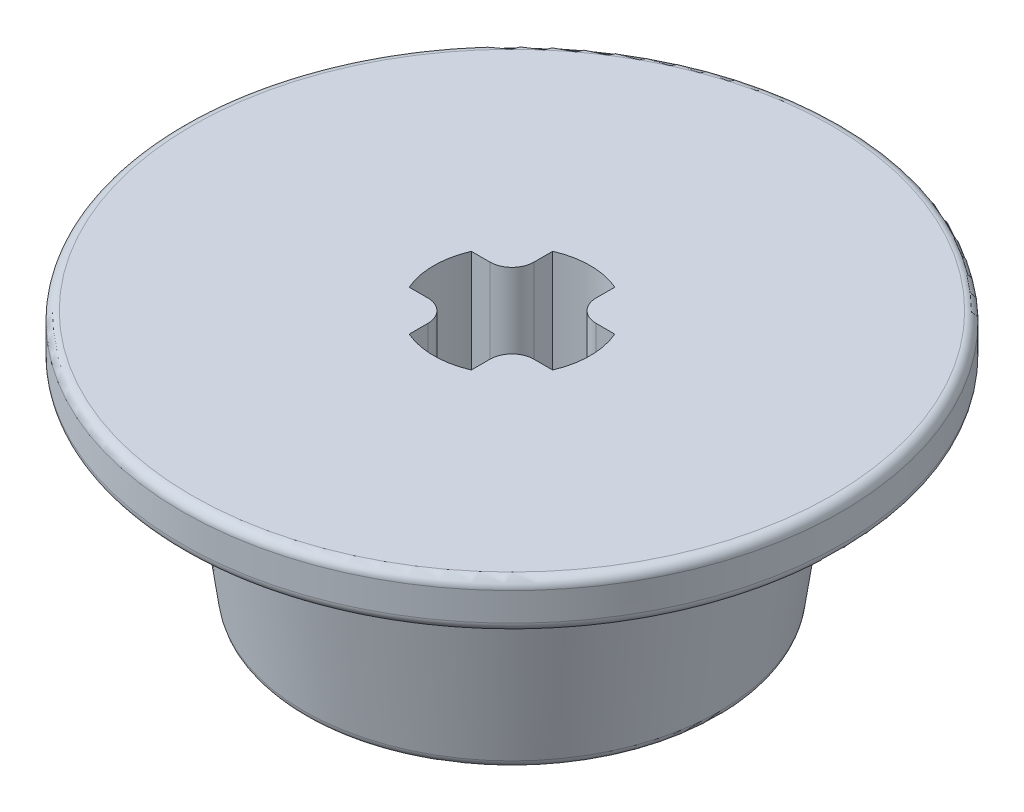
ISO-10303-21;
HEADER;
FILE_DESCRIPTION(('STEP AP214'),'2;1');
FILE_NAME('part.step','',(''),(''),'','','');
FILE_SCHEMA(('AUTOMOTIVE_DESIGN { 1 0 10303 214 1 1 1 1 }'));
ENDSEC;
DATA;
#1=APPLICATION_CONTEXT('core data for automotive mechanical design processes');
#2=APPLICATION_PROTOCOL_DEFINITION('international standard','automotive_design',2000,#1);
#3=PRODUCT_CONTEXT('',#1,'mechanical');
#4=PRODUCT('Part','Part','',(#3));
#5=PRODUCT_RELATED_PRODUCT_CATEGORY('part','',(#4));
#6=PRODUCT_DEFINITION_FORMATION('','',#4);
#7=PRODUCT_DEFINITION_CONTEXT('part definition',#1,'design');
#8=PRODUCT_DEFINITION('design','',#6,#7);
#9=PRODUCT_DEFINITION_SHAPE('','',#8);
#10=(LENGTH_UNIT() NAMED_UNIT(*) SI_UNIT(.MILLI.,.METRE.));
#11=(NAMED_UNIT(*) PLANE_ANGLE_UNIT() SI_UNIT($,.RADIAN.));
#12=(NAMED_UNIT(*) SI_UNIT($,.STERADIAN.) SOLID_ANGLE_UNIT());
#13=UNCERTAINTY_MEASURE_WITH_UNIT(LENGTH_MEASURE(1.E-05),#10,'distance_accuracy_value','');
#14=(GEOMETRIC_REPRESENTATION_CONTEXT(3) GLOBAL_UNCERTAINTY_ASSIGNED_CONTEXT((#13)) GLOBAL_UNIT_ASSIGNED_CONTEXT((#10,
#11,#12)) REPRESENTATION_CONTEXT('',''));
#15=CARTESIAN_POINT('',(0.,0.,0.));
#16=DIRECTION('',(0.,0.,1.));
#17=DIRECTION('',(1.,0.,0.));
#18=AXIS2_PLACEMENT_3D('',#15,#16,#17);
#19=CARTESIAN_POINT('',(0.,-1.83679026849459E-11,0.));
#20=DIRECTION('',(0.,1.,0.));
#21=DIRECTION('',(0.,0.,1.));
#22=AXIS2_PLACEMENT_3D('',#19,#20,#21);
#23=PLANE('',#22);
#24=CARTESIAN_POINT('',(0.,-1.83679026849459E-11,0.));
#25=DIRECTION('',(0.,1.,0.));
#26=DIRECTION('',(0.,0.,1.));
#27=AXIS2_PLACEMENT_3D('',#24,#25,#26);
#28=CIRCLE('',#27,10.2);
#29=CARTESIAN_POINT('',(0.,-1.83679026849459E-11,10.2));
#30=VERTEX_POINT('',#29);
#31=EDGE_CURVE('E292',#30,#30,#28,.T.);
#32=ORIENTED_EDGE('',*,*,#31,.T.);
#33=EDGE_LOOP('',(#32));
#34=FACE_BOUND('',#33,.T.);
#35=DIRECTION('',(0.,0.,1.));
#36=VECTOR('',#35,1.);
#37=CARTESIAN_POINT('',(-0.99,0.,0.990000000000009));
#38=LINE('',#37,#36);
#39=CARTESIAN_POINT('',(-0.99,0.,1.69000000000001));
#40=VERTEX_POINT('',#39);
#41=CARTESIAN_POINT('',(-0.99,0.,2.28473193175917));
#42=VERTEX_POINT('',#41);
#43=EDGE_CURVE('E209',#40,#42,#38,.T.);
#44=ORIENTED_EDGE('',*,*,#43,.F.);
#45=CARTESIAN_POINT('',(-1.69,-1.83672521636424E-11,1.69000000000001));
#46=DIRECTION('',(0.,1.,0.));
#47=DIRECTION('',(0.,0.,1.));
#48=AXIS2_PLACEMENT_3D('',#45,#46,#47);
#49=CIRCLE('',#48,0.7);
#50=CARTESIAN_POINT('',(-1.69,0.,0.990000000000009));
#51=VERTEX_POINT('',#50);
#52=EDGE_CURVE('E253',#40,#51,#49,.T.);
#53=ORIENTED_EDGE('',*,*,#52,.T.);
#54=DIRECTION('',(1.,0.,0.));
#55=VECTOR('',#54,1.);
#56=CARTESIAN_POINT('',(-2.28473193175917,0.,0.990000000000009));
#57=LINE('',#56,#55);
#58=CARTESIAN_POINT('',(-2.28473193175917,0.,0.99000000000001));
#59=VERTEX_POINT('',#58);
#60=EDGE_CURVE('E207',#59,#51,#57,.T.);
#61=ORIENTED_EDGE('',*,*,#60,.F.);
#62=CARTESIAN_POINT('',(0.,0.,0.));
#63=DIRECTION('',(0.,1.,0.));
#64=DIRECTION('',(0.,0.,1.));
#65=AXIS2_PLACEMENT_3D('',#62,#63,#64);
#66=CIRCLE('',#65,2.49);
#67=CARTESIAN_POINT('',(-2.28473193175917,0.,-0.99000000000001));
#68=VERTEX_POINT('',#67);
#69=EDGE_CURVE('E159',#68,#59,#66,.T.);
#70=ORIENTED_EDGE('',*,*,#69,.F.);
#71=DIRECTION('',(-1.,0.,0.));
#72=VECTOR('',#71,1.);
#73=CARTESIAN_POINT('',(-0.99,0.,-0.99000000000001));
#74=LINE('',#73,#72);
#75=CARTESIAN_POINT('',(-1.69,0.,-0.99000000000001));
#76=VERTEX_POINT('',#75);
#77=EDGE_CURVE('E204',#76,#68,#74,.T.);
#78=ORIENTED_EDGE('',*,*,#77,.F.);
#79=CARTESIAN_POINT('',(-1.69,-1.83672521636424E-11,-1.69000000000001));
#80=DIRECTION('',(0.,1.,0.));
#81=DIRECTION('',(0.,0.,1.));
#82=AXIS2_PLACEMENT_3D('',#79,#80,#81);
#83=CIRCLE('',#82,0.7);
#84=CARTESIAN_POINT('',(-0.99,0.,-1.69000000000001));
#85=VERTEX_POINT('',#84);
#86=EDGE_CURVE('E247',#76,#85,#83,.T.);
#87=ORIENTED_EDGE('',*,*,#86,.T.);
#88=DIRECTION('',(0.,0.,1.));
#89=VECTOR('',#88,1.);
#90=CARTESIAN_POINT('',(-0.99,0.,-2.28753254026193));
#91=LINE('',#90,#89);
#92=CARTESIAN_POINT('',(-0.99,0.,-2.28753254026193));
#93=VERTEX_POINT('',#92);
#94=EDGE_CURVE('E201',#93,#85,#91,.T.);
#95=ORIENTED_EDGE('',*,*,#94,.F.);
#96=CARTESIAN_POINT('',(0.,0.,0.));
#97=DIRECTION('',(0.,1.,0.));
#98=DIRECTION('',(0.,0.,-1.));
#99=AXIS2_PLACEMENT_3D('',#96,#97,#98);
#100=CIRCLE('',#99,2.49256998352247);
#101=CARTESIAN_POINT('',(0.99,0.,-2.28753254026193));
#102=VERTEX_POINT('',#101);
#103=EDGE_CURVE('E226',#102,#93,#100,.T.);
#104=ORIENTED_EDGE('',*,*,#103,.F.);
#105=DIRECTION('',(0.,0.,-1.));
#106=VECTOR('',#105,1.);
#107=CARTESIAN_POINT('',(0.99,0.,-2.28753254026193));
#108=LINE('',#107,#106);
#109=CARTESIAN_POINT('',(0.99,0.,-1.69));
#110=VERTEX_POINT('',#109);
#111=EDGE_CURVE('E224',#110,#102,#108,.T.);
#112=ORIENTED_EDGE('',*,*,#111,.F.);
#113=CARTESIAN_POINT('',(1.69,-1.83672521636424E-11,-1.69));
#114=DIRECTION('',(0.,1.,0.));
#115=DIRECTION('',(0.,0.,1.));
#116=AXIS2_PLACEMENT_3D('',#113,#114,#115);
#117=CIRCLE('',#116,0.7);
#118=CARTESIAN_POINT('',(1.69,0.,-0.990000000000003));
#119=VERTEX_POINT('',#118);
#120=EDGE_CURVE('E249',#110,#119,#117,.T.);
#121=ORIENTED_EDGE('',*,*,#120,.T.);
#122=DIRECTION('',(-1.,0.,0.));
#123=VECTOR('',#122,1.);
#124=CARTESIAN_POINT('',(0.99,0.,-0.990000000000003));
#125=LINE('',#124,#123);
#126=CARTESIAN_POINT('',(2.28424982597489,0.,-0.990000000000003));
#127=VERTEX_POINT('',#126);
#128=EDGE_CURVE('E222',#127,#119,#125,.T.);
#129=ORIENTED_EDGE('',*,*,#128,.F.);
#130=CARTESIAN_POINT('',(0.,0.,0.));
#131=DIRECTION('',(0.,1.,0.));
#132=DIRECTION('',(0.,0.,-1.));
#133=AXIS2_PLACEMENT_3D('',#130,#131,#132);
#134=CIRCLE('',#133,2.48955764493742);
#135=CARTESIAN_POINT('',(2.28424982597489,0.,0.990000000000003));
#136=VERTEX_POINT('',#135);
#137=EDGE_CURVE('E219',#136,#127,#134,.T.);
#138=ORIENTED_EDGE('',*,*,#137,.F.);
#139=DIRECTION('',(1.,0.,0.));
#140=VECTOR('',#139,1.);
#141=CARTESIAN_POINT('',(0.99,0.,0.990000000000003));
#142=LINE('',#141,#140);
#143=CARTESIAN_POINT('',(1.69,0.,0.990000000000003));
#144=VERTEX_POINT('',#143);
#145=EDGE_CURVE('E217',#144,#136,#142,.T.);
#146=ORIENTED_EDGE('',*,*,#145,.F.);
#147=CARTESIAN_POINT('',(1.69,-1.83672521636424E-11,1.69));
#148=DIRECTION('',(0.,1.,0.));
#149=DIRECTION('',(0.,0.,1.));
#150=AXIS2_PLACEMENT_3D('',#147,#148,#149);
#151=CIRCLE('',#150,0.7);
#152=CARTESIAN_POINT('',(0.99,0.,1.69));
#153=VERTEX_POINT('',#152);
#154=EDGE_CURVE('E251',#144,#153,#151,.T.);
#155=ORIENTED_EDGE('',*,*,#154,.T.);
#156=DIRECTION('',(0.,0.,-1.));
#157=VECTOR('',#156,1.);
#158=CARTESIAN_POINT('',(0.99,0.,2.28473193175917));
#159=LINE('',#158,#157);
#160=CARTESIAN_POINT('',(0.99,0.,2.28473193175917));
#161=VERTEX_POINT('',#160);
#162=EDGE_CURVE('E214',#161,#153,#159,.T.);
#163=ORIENTED_EDGE('',*,*,#162,.F.);
#164=CARTESIAN_POINT('',(0.,0.,0.));
#165=DIRECTION('',(0.,1.,0.));
#166=DIRECTION('',(0.,0.,1.));
#167=AXIS2_PLACEMENT_3D('',#164,#165,#166);
#168=CIRCLE('',#167,2.49);
#169=EDGE_CURVE('E211',#42,#161,#168,.T.);
#170=ORIENTED_EDGE('',*,*,#169,.F.);
#171=EDGE_LOOP('',(#44,#53,#61,#70,#78,#87,#95,#104,#112,#121,#129,#138,#146,#155,#163,#170));
#172=FACE_BOUND('',#171,.T.);
#173=ADVANCED_FACE('F36',(#34,#172),#23,.T.);
#174=CARTESIAN_POINT('',(0.,0.,0.));
#175=DIRECTION('',(0.,-1.,0.));
#176=DIRECTION('',(0.,0.,-1.));
#177=AXIS2_PLACEMENT_3D('',#174,#175,#176);
#178=CYLINDRICAL_SURFACE('',#177,10.5);
#179=CARTESIAN_POINT('',(0.,-0.300000000018368,0.));
#180=DIRECTION('',(0.,1.,0.));
#181=DIRECTION('',(0.,0.,1.));
#182=AXIS2_PLACEMENT_3D('',#179,#180,#181);
#183=CIRCLE('',#182,10.5);
#184=CARTESIAN_POINT('',(0.,-0.300000000018368,10.5));
#185=VERTEX_POINT('',#184);
#186=EDGE_CURVE('E289',#185,#185,#183,.F.);
#187=ORIENTED_EDGE('',*,*,#186,.T.);
#188=EDGE_LOOP('',(#187));
#189=FACE_BOUND('',#188,.T.);
#190=CARTESIAN_POINT('',(0.,-1.2,0.));
#191=DIRECTION('',(0.,-1.,0.));
#192=DIRECTION('',(0.,0.,-1.));
#193=AXIS2_PLACEMENT_3D('',#190,#191,#192);
#194=CIRCLE('',#193,10.5);
#195=CARTESIAN_POINT('',(0.,-1.2,-10.5));
#196=VERTEX_POINT('',#195);
#197=EDGE_CURVE('E286',#196,#196,#194,.F.);
#198=ORIENTED_EDGE('',*,*,#197,.T.);
#199=EDGE_LOOP('',(#198));
#200=FACE_BOUND('',#199,.T.);
#201=ADVANCED_FACE('F309',(#189,#200),#178,.T.);
#202=CARTESIAN_POINT('',(10.5,-1.5,0.));
#203=DIRECTION('',(0.,-1.,0.));
#204=DIRECTION('',(0.,0.,-1.));
#205=AXIS2_PLACEMENT_3D('',#202,#203,#204);
#206=PLANE('',#205);
#207=CARTESIAN_POINT('',(0.,-1.5,0.));
#208=DIRECTION('',(0.,-1.,0.));
#209=DIRECTION('',(0.,0.,-1.));
#210=AXIS2_PLACEMENT_3D('',#207,#208,#209);
#211=CIRCLE('',#210,7.76078602134487);
#212=CARTESIAN_POINT('',(0.,-1.5,-7.76078602134487));
#213=VERTEX_POINT('',#212);
#214=EDGE_CURVE('E11',#213,#213,#211,.F.);
#215=ORIENTED_EDGE('',*,*,#214,.T.);
#216=EDGE_LOOP('',(#215));
#217=FACE_BOUND('',#216,.T.);
#218=CARTESIAN_POINT('',(0.,-1.5,0.));
#219=DIRECTION('',(0.,-1.,0.));
#220=DIRECTION('',(0.,0.,-1.));
#221=AXIS2_PLACEMENT_3D('',#218,#219,#220);
#222=CIRCLE('',#221,10.2);
#223=CARTESIAN_POINT('',(0.,-1.5,-10.2));
#224=VERTEX_POINT('',#223);
#225=EDGE_CURVE('E44',#224,#224,#222,.T.);
#226=ORIENTED_EDGE('',*,*,#225,.T.);
#227=EDGE_LOOP('',(#226));
#228=FACE_BOUND('',#227,.T.);
#229=ADVANCED_FACE('F297',(#217,#228),#206,.T.);
#230=CARTESIAN_POINT('',(0.,-8.,0.));
#231=DIRECTION('',(0.,1.,0.));
#232=DIRECTION('',(0.,0.,1.));
#233=AXIS2_PLACEMENT_3D('',#230,#231,#232);
#234=CONICAL_SURFACE('',#233,6.58648457443446,0.139626340159546);
#235=CARTESIAN_POINT('',(0.,-7.74175193028802,0.));
#236=DIRECTION('',(0.,-1.,0.));
#237=DIRECTION('',(0.,0.,-1.));
#238=AXIS2_PLACEMENT_3D('',#235,#236,#237);
#239=CIRCLE('',#238,6.62277897371206);
#240=CARTESIAN_POINT('',(0.,-7.74175193028802,-6.62277897371206));
#241=VERTEX_POINT('',#240);
#242=EDGE_CURVE('E283',#241,#241,#239,.F.);
#243=ORIENTED_EDGE('',*,*,#242,.T.);
#244=EDGE_LOOP('',(#243));
#245=FACE_BOUND('',#244,.T.);
#246=CARTESIAN_POINT('',(0.,-1.75824806971198,0.));
#247=DIRECTION('',(0.,1.,0.));
#248=DIRECTION('',(0.,0.,1.));
#249=AXIS2_PLACEMENT_3D('',#246,#247,#248);
#250=CIRCLE('',#249,7.4637056007224);
#251=CARTESIAN_POINT('',(0.,-1.75824806971198,7.4637056007224));
#252=VERTEX_POINT('',#251);
#253=EDGE_CURVE('E280',#252,#252,#250,.F.);
#254=ORIENTED_EDGE('',*,*,#253,.T.);
#255=EDGE_LOOP('',(#254));
#256=FACE_BOUND('',#255,.T.);
#257=ADVANCED_FACE('F519',(#245,#256),#234,.T.);
#258=CARTESIAN_POINT('',(6.58648457443446,-8.,0.));
#259=DIRECTION('',(0.,-1.,0.));
#260=DIRECTION('',(0.,0.,-1.));
#261=AXIS2_PLACEMENT_3D('',#258,#259,#260);
#262=PLANE('',#261);
#263=CARTESIAN_POINT('',(0.,-8.,0.));
#264=DIRECTION('',(0.,-1.,0.));
#265=DIRECTION('',(0.,0.,-1.));
#266=AXIS2_PLACEMENT_3D('',#263,#264,#265);
#267=CIRCLE('',#266,6.32569855308959);
#268=CARTESIAN_POINT('',(0.,-8.,-6.32569855308959));
#269=VERTEX_POINT('',#268);
#270=EDGE_CURVE('E277',#269,#269,#267,.T.);
#271=ORIENTED_EDGE('',*,*,#270,.T.);
#272=EDGE_LOOP('',(#271));
#273=FACE_BOUND('',#272,.T.);
#274=DIRECTION('',(1.,0.,0.));
#275=VECTOR('',#274,1.);
#276=CARTESIAN_POINT('',(-2.28473193175917,-8.,0.990000000000009));
#277=LINE('',#276,#275);
#278=CARTESIAN_POINT('',(-2.28473193175917,-8.,0.99000000000001));
#279=VERTEX_POINT('',#278);
#280=CARTESIAN_POINT('',(-1.69,-8.,0.990000000000009));
#281=VERTEX_POINT('',#280);
#282=EDGE_CURVE('E167',#279,#281,#277,.T.);
#283=ORIENTED_EDGE('',*,*,#282,.T.);
#284=CARTESIAN_POINT('',(-1.69,-8.,1.69000000000001));
#285=DIRECTION('',(0.,-1.,0.));
#286=DIRECTION('',(0.,0.,-1.));
#287=AXIS2_PLACEMENT_3D('',#284,#285,#286);
#288=CIRCLE('',#287,0.7);
#289=CARTESIAN_POINT('',(-0.99,-8.,1.69000000000001));
#290=VERTEX_POINT('',#289);
#291=EDGE_CURVE('E261',#281,#290,#288,.T.);
#292=ORIENTED_EDGE('',*,*,#291,.T.);
#293=DIRECTION('',(0.,0.,1.));
#294=VECTOR('',#293,1.);
#295=CARTESIAN_POINT('',(-0.99,-8.,0.990000000000009));
#296=LINE('',#295,#294);
#297=CARTESIAN_POINT('',(-0.99,-8.,2.28473193175917));
#298=VERTEX_POINT('',#297);
#299=EDGE_CURVE('E172',#290,#298,#296,.T.);
#300=ORIENTED_EDGE('',*,*,#299,.T.);
#301=CARTESIAN_POINT('',(0.,-8.,0.));
#302=DIRECTION('',(0.,1.,0.));
#303=DIRECTION('',(0.,0.,1.));
#304=AXIS2_PLACEMENT_3D('',#301,#302,#303);
#305=CIRCLE('',#304,2.49);
#306=CARTESIAN_POINT('',(0.99,-8.,2.28473193175917));
#307=VERTEX_POINT('',#306);
#308=EDGE_CURVE('E183',#298,#307,#305,.T.);
#309=ORIENTED_EDGE('',*,*,#308,.T.);
#310=DIRECTION('',(0.,0.,-1.));
#311=VECTOR('',#310,1.);
#312=CARTESIAN_POINT('',(0.99,-8.,2.28473193175917));
#313=LINE('',#312,#311);
#314=CARTESIAN_POINT('',(0.99,-8.,1.69));
#315=VERTEX_POINT('',#314);
#316=EDGE_CURVE('E186',#307,#315,#313,.T.);
#317=ORIENTED_EDGE('',*,*,#316,.T.);
#318=CARTESIAN_POINT('',(1.69,-8.,1.69));
#319=DIRECTION('',(0.,-1.,0.));
#320=DIRECTION('',(0.,0.,-1.));
#321=AXIS2_PLACEMENT_3D('',#318,#319,#320);
#322=CIRCLE('',#321,0.7);
#323=CARTESIAN_POINT('',(1.69,-8.,0.990000000000003));
#324=VERTEX_POINT('',#323);
#325=EDGE_CURVE('E259',#315,#324,#322,.T.);
#326=ORIENTED_EDGE('',*,*,#325,.T.);
#327=DIRECTION('',(1.,0.,0.));
#328=VECTOR('',#327,1.);
#329=CARTESIAN_POINT('',(0.99,-8.,0.990000000000003));
#330=LINE('',#329,#328);
#331=CARTESIAN_POINT('',(2.28424982597489,-8.,0.990000000000003));
#332=VERTEX_POINT('',#331);
#333=EDGE_CURVE('E189',#324,#332,#330,.T.);
#334=ORIENTED_EDGE('',*,*,#333,.T.);
#335=CARTESIAN_POINT('',(0.,-8.,0.));
#336=DIRECTION('',(0.,1.,0.));
#337=DIRECTION('',(0.,0.,-1.));
#338=AXIS2_PLACEMENT_3D('',#335,#336,#337);
#339=CIRCLE('',#338,2.48955764493742);
#340=CARTESIAN_POINT('',(2.28424982597489,-8.,-0.990000000000003));
#341=VERTEX_POINT('',#340);
#342=EDGE_CURVE('E191',#332,#341,#339,.T.);
#343=ORIENTED_EDGE('',*,*,#342,.T.);
#344=DIRECTION('',(-1.,0.,0.));
#345=VECTOR('',#344,1.);
#346=CARTESIAN_POINT('',(0.99,-8.,-0.990000000000003));
#347=LINE('',#346,#345);
#348=CARTESIAN_POINT('',(1.69,-8.,-0.990000000000003));
#349=VERTEX_POINT('',#348);
#350=EDGE_CURVE('E194',#341,#349,#347,.T.);
#351=ORIENTED_EDGE('',*,*,#350,.T.);
#352=CARTESIAN_POINT('',(1.69,-8.,-1.69));
#353=DIRECTION('',(0.,-1.,0.));
#354=DIRECTION('',(0.,0.,-1.));
#355=AXIS2_PLACEMENT_3D('',#352,#353,#354);
#356=CIRCLE('',#355,0.7);
#357=CARTESIAN_POINT('',(0.99,-8.,-1.69));
#358=VERTEX_POINT('',#357);
#359=EDGE_CURVE('E51',#349,#358,#356,.T.);
#360=ORIENTED_EDGE('',*,*,#359,.T.);
#361=DIRECTION('',(0.,0.,-1.));
#362=VECTOR('',#361,1.);
#363=CARTESIAN_POINT('',(0.99,-8.,-2.28753254026193));
#364=LINE('',#363,#362);
#365=CARTESIAN_POINT('',(0.99,-8.,-2.28753254026193));
#366=VERTEX_POINT('',#365);
#367=EDGE_CURVE('E196',#358,#366,#364,.T.);
#368=ORIENTED_EDGE('',*,*,#367,.T.);
#369=CARTESIAN_POINT('',(0.,-8.,0.));
#370=DIRECTION('',(0.,1.,0.));
#371=DIRECTION('',(0.,0.,-1.));
#372=AXIS2_PLACEMENT_3D('',#369,#370,#371);
#373=CIRCLE('',#372,2.49256998352247);
#374=CARTESIAN_POINT('',(-0.99,-8.,-2.28753254026193));
#375=VERTEX_POINT('',#374);
#376=EDGE_CURVE('E198',#366,#375,#373,.T.);
#377=ORIENTED_EDGE('',*,*,#376,.T.);
#378=DIRECTION('',(0.,0.,1.));
#379=VECTOR('',#378,1.);
#380=CARTESIAN_POINT('',(-0.99,-8.,-2.28753254026193));
#381=LINE('',#380,#379);
#382=CARTESIAN_POINT('',(-0.99,-8.,-1.69000000000001));
#383=VERTEX_POINT('',#382);
#384=EDGE_CURVE('E178',#375,#383,#381,.T.);
#385=ORIENTED_EDGE('',*,*,#384,.T.);
#386=CARTESIAN_POINT('',(-1.69,-8.,-1.69000000000001));
#387=DIRECTION('',(0.,-1.,0.));
#388=DIRECTION('',(0.,0.,-1.));
#389=AXIS2_PLACEMENT_3D('',#386,#387,#388);
#390=CIRCLE('',#389,0.7);
#391=CARTESIAN_POINT('',(-1.69,-8.,-0.99000000000001));
#392=VERTEX_POINT('',#391);
#393=EDGE_CURVE('E256',#383,#392,#390,.T.);
#394=ORIENTED_EDGE('',*,*,#393,.T.);
#395=DIRECTION('',(-1.,0.,0.));
#396=VECTOR('',#395,1.);
#397=CARTESIAN_POINT('',(-0.99,-8.,-0.99000000000001));
#398=LINE('',#397,#396);
#399=CARTESIAN_POINT('',(-2.28473193175917,-8.,-0.99000000000001));
#400=VERTEX_POINT('',#399);
#401=EDGE_CURVE('E176',#392,#400,#398,.T.);
#402=ORIENTED_EDGE('',*,*,#401,.T.);
#403=CARTESIAN_POINT('',(0.,-8.,0.));
#404=DIRECTION('',(0.,1.,0.));
#405=DIRECTION('',(0.,0.,1.));
#406=AXIS2_PLACEMENT_3D('',#403,#404,#405);
#407=CIRCLE('',#406,2.49);
#408=EDGE_CURVE('E156',#400,#279,#407,.T.);
#409=ORIENTED_EDGE('',*,*,#408,.T.);
#410=EDGE_LOOP('',(#283,#292,#300,#309,#317,#326,#334,#343,#351,#360,#368,#377,#385,#394,#402,#409));
#411=FACE_BOUND('',#410,.T.);
#412=ADVANCED_FACE('F174',(#273,#411),#262,.T.);
#413=CARTESIAN_POINT('',(-0.99,-8.,-2.28753254026193));
#414=DIRECTION('',(-1.,0.,0.));
#415=DIRECTION('',(0.,0.,1.));
#416=AXIS2_PLACEMENT_3D('',#413,#414,#415);
#417=PLANE('',#416);
#418=ORIENTED_EDGE('',*,*,#94,.T.);
#419=DIRECTION('',(0.,1.,0.));
#420=VECTOR('',#419,1.);
#421=CARTESIAN_POINT('',(-0.99,-8.,-1.69000000000001));
#422=LINE('',#421,#420);
#423=EDGE_CURVE('E275',#85,#383,#422,.F.);
#424=ORIENTED_EDGE('',*,*,#423,.T.);
#425=ORIENTED_EDGE('',*,*,#384,.F.);
#426=DIRECTION('',(0.,1.,0.));
#427=VECTOR('',#426,1.);
#428=CARTESIAN_POINT('',(-0.99,-8.,-2.28753254026193));
#429=LINE('',#428,#427);
#430=EDGE_CURVE('E229',#375,#93,#429,.T.);
#431=ORIENTED_EDGE('',*,*,#430,.T.);
#432=EDGE_LOOP('',(#418,#424,#425,#431));
#433=FACE_BOUND('',#432,.T.);
#434=ADVANCED_FACE('F500',(#433),#417,.F.);
#435=CARTESIAN_POINT('',(0.,-8.,0.));
#436=DIRECTION('',(0.,1.,0.));
#437=DIRECTION('',(0.,0.,1.));
#438=AXIS2_PLACEMENT_3D('',#435,#436,#437);
#439=CYLINDRICAL_SURFACE('',#438,2.49256998352247);
#440=ORIENTED_EDGE('',*,*,#103,.T.);
#441=ORIENTED_EDGE('',*,*,#430,.F.);
#442=ORIENTED_EDGE('',*,*,#376,.F.);
#443=DIRECTION('',(0.,1.,0.));
#444=VECTOR('',#443,1.);
#445=CARTESIAN_POINT('',(0.99,-8.,-2.28753254026193));
#446=LINE('',#445,#444);
#447=EDGE_CURVE('E232',#366,#102,#446,.T.);
#448=ORIENTED_EDGE('',*,*,#447,.T.);
#449=EDGE_LOOP('',(#440,#441,#442,#448));
#450=FACE_BOUND('',#449,.T.);
#451=ADVANCED_FACE('F490',(#450),#439,.F.);
#452=CARTESIAN_POINT('',(0.99,-8.,-2.28753254026193));
#453=DIRECTION('',(1.,0.,0.));
#454=DIRECTION('',(0.,0.,-1.));
#455=AXIS2_PLACEMENT_3D('',#452,#453,#454);
#456=PLANE('',#455);
#457=ORIENTED_EDGE('',*,*,#367,.F.);
#458=DIRECTION('',(0.,1.,0.));
#459=VECTOR('',#458,1.);
#460=CARTESIAN_POINT('',(0.99,-8.,-1.69));
#461=LINE('',#460,#459);
#462=EDGE_CURVE('E268',#358,#110,#461,.T.);
#463=ORIENTED_EDGE('',*,*,#462,.T.);
#464=ORIENTED_EDGE('',*,*,#111,.T.);
#465=ORIENTED_EDGE('',*,*,#447,.F.);
#466=EDGE_LOOP('',(#457,#463,#464,#465));
#467=FACE_BOUND('',#466,.T.);
#468=ADVANCED_FACE('F481',(#467),#456,.F.);
#469=CARTESIAN_POINT('',(0.99,-8.,-0.990000000000003));
#470=DIRECTION('',(0.,0.,-1.));
#471=DIRECTION('',(-1.,0.,0.));
#472=AXIS2_PLACEMENT_3D('',#469,#470,#471);
#473=PLANE('',#472);
#474=ORIENTED_EDGE('',*,*,#128,.T.);
#475=DIRECTION('',(0.,1.,0.));
#476=VECTOR('',#475,1.);
#477=CARTESIAN_POINT('',(1.69,-8.,-0.990000000000003));
#478=LINE('',#477,#476);
#479=EDGE_CURVE('E59',#119,#349,#478,.F.);
#480=ORIENTED_EDGE('',*,*,#479,.T.);
#481=ORIENTED_EDGE('',*,*,#350,.F.);
#482=DIRECTION('',(0.,1.,0.));
#483=VECTOR('',#482,1.);
#484=CARTESIAN_POINT('',(2.28424982597489,-8.,-0.990000000000003));
#485=LINE('',#484,#483);
#486=EDGE_CURVE('E235',#341,#127,#485,.T.);
#487=ORIENTED_EDGE('',*,*,#486,.T.);
#488=EDGE_LOOP('',(#474,#480,#481,#487));
#489=FACE_BOUND('',#488,.T.);
#490=ADVANCED_FACE('F471',(#489),#473,.F.);
#491=CARTESIAN_POINT('',(0.,-8.,0.));
#492=DIRECTION('',(0.,1.,0.));
#493=DIRECTION('',(0.,0.,1.));
#494=AXIS2_PLACEMENT_3D('',#491,#492,#493);
#495=CYLINDRICAL_SURFACE('',#494,2.48955764493742);
#496=ORIENTED_EDGE('',*,*,#137,.T.);
#497=ORIENTED_EDGE('',*,*,#486,.F.);
#498=ORIENTED_EDGE('',*,*,#342,.F.);
#499=DIRECTION('',(0.,1.,0.));
#500=VECTOR('',#499,1.);
#501=CARTESIAN_POINT('',(2.28424982597489,-8.,0.990000000000003));
#502=LINE('',#501,#500);
#503=EDGE_CURVE('E237',#332,#136,#502,.T.);
#504=ORIENTED_EDGE('',*,*,#503,.T.);
#505=EDGE_LOOP('',(#496,#497,#498,#504));
#506=FACE_BOUND('',#505,.T.);
#507=ADVANCED_FACE('F461',(#506),#495,.F.);
#508=CARTESIAN_POINT('',(0.99,-8.,0.990000000000003));
#509=DIRECTION('',(0.,0.,1.));
#510=DIRECTION('',(1.,0.,0.));
#511=AXIS2_PLACEMENT_3D('',#508,#509,#510);
#512=PLANE('',#511);
#513=ORIENTED_EDGE('',*,*,#333,.F.);
#514=DIRECTION('',(0.,1.,0.));
#515=VECTOR('',#514,1.);
#516=CARTESIAN_POINT('',(1.69,-8.,0.990000000000003));
#517=LINE('',#516,#515);
#518=EDGE_CURVE('E263',#324,#144,#517,.T.);
#519=ORIENTED_EDGE('',*,*,#518,.T.);
#520=ORIENTED_EDGE('',*,*,#145,.T.);
#521=ORIENTED_EDGE('',*,*,#503,.F.);
#522=EDGE_LOOP('',(#513,#519,#520,#521));
#523=FACE_BOUND('',#522,.T.);
#524=ADVANCED_FACE('F451',(#523),#512,.F.);
#525=CARTESIAN_POINT('',(0.99,-8.,2.28473193175917));
#526=DIRECTION('',(1.,0.,0.));
#527=DIRECTION('',(0.,0.,-1.));
#528=AXIS2_PLACEMENT_3D('',#525,#526,#527);
#529=PLANE('',#528);
#530=ORIENTED_EDGE('',*,*,#162,.T.);
#531=DIRECTION('',(0.,1.,0.));
#532=VECTOR('',#531,1.);
#533=CARTESIAN_POINT('',(0.99,-8.,1.69));
#534=LINE('',#533,#532);
#535=EDGE_CURVE('E266',#153,#315,#534,.F.);
#536=ORIENTED_EDGE('',*,*,#535,.T.);
#537=ORIENTED_EDGE('',*,*,#316,.F.);
#538=DIRECTION('',(0.,1.,0.));
#539=VECTOR('',#538,1.);
#540=CARTESIAN_POINT('',(0.99,-8.,2.28473193175917));
#541=LINE('',#540,#539);
#542=EDGE_CURVE('E240',#307,#161,#541,.T.);
#543=ORIENTED_EDGE('',*,*,#542,.T.);
#544=EDGE_LOOP('',(#530,#536,#537,#543));
#545=FACE_BOUND('',#544,.T.);
#546=ADVANCED_FACE('F441',(#545),#529,.F.);
#547=CARTESIAN_POINT('',(0.,-8.,0.));
#548=DIRECTION('',(0.,1.,0.));
#549=DIRECTION('',(0.,0.,1.));
#550=AXIS2_PLACEMENT_3D('',#547,#548,#549);
#551=CYLINDRICAL_SURFACE('',#550,2.49);
#552=ORIENTED_EDGE('',*,*,#169,.T.);
#553=ORIENTED_EDGE('',*,*,#542,.F.);
#554=ORIENTED_EDGE('',*,*,#308,.F.);
#555=DIRECTION('',(0.,1.,0.));
#556=VECTOR('',#555,1.);
#557=CARTESIAN_POINT('',(-0.99,-8.,2.28473193175917));
#558=LINE('',#557,#556);
#559=EDGE_CURVE('E163',#298,#42,#558,.T.);
#560=ORIENTED_EDGE('',*,*,#559,.T.);
#561=EDGE_LOOP('',(#552,#553,#554,#560));
#562=FACE_BOUND('',#561,.T.);
#563=ADVANCED_FACE('F431',(#562),#551,.F.);
#564=CARTESIAN_POINT('',(-0.99,-8.,0.990000000000009));
#565=DIRECTION('',(-1.,0.,0.));
#566=DIRECTION('',(0.,0.,1.));
#567=AXIS2_PLACEMENT_3D('',#564,#565,#566);
#568=PLANE('',#567);
#569=ORIENTED_EDGE('',*,*,#299,.F.);
#570=DIRECTION('',(0.,1.,0.));
#571=VECTOR('',#570,1.);
#572=CARTESIAN_POINT('',(-0.99,-8.,1.69000000000001));
#573=LINE('',#572,#571);
#574=EDGE_CURVE('E231',#290,#40,#573,.T.);
#575=ORIENTED_EDGE('',*,*,#574,.T.);
#576=ORIENTED_EDGE('',*,*,#43,.T.);
#577=ORIENTED_EDGE('',*,*,#559,.F.);
#578=EDGE_LOOP('',(#569,#575,#576,#577));
#579=FACE_BOUND('',#578,.T.);
#580=ADVANCED_FACE('F422',(#579),#568,.F.);
#581=CARTESIAN_POINT('',(-2.28473193175917,-8.,0.990000000000009));
#582=DIRECTION('',(0.,0.,1.));
#583=DIRECTION('',(1.,0.,0.));
#584=AXIS2_PLACEMENT_3D('',#581,#582,#583);
#585=PLANE('',#584);
#586=ORIENTED_EDGE('',*,*,#60,.T.);
#587=DIRECTION('',(0.,1.,0.));
#588=VECTOR('',#587,1.);
#589=CARTESIAN_POINT('',(-1.69,-8.,0.990000000000009));
#590=LINE('',#589,#588);
#591=EDGE_CURVE('E170',#51,#281,#590,.F.);
#592=ORIENTED_EDGE('',*,*,#591,.T.);
#593=ORIENTED_EDGE('',*,*,#282,.F.);
#594=DIRECTION('',(0.,1.,0.));
#595=VECTOR('',#594,1.);
#596=CARTESIAN_POINT('',(-2.28473193175917,-8.,0.99000000000001));
#597=LINE('',#596,#595);
#598=EDGE_CURVE('E151',#279,#59,#597,.T.);
#599=ORIENTED_EDGE('',*,*,#598,.T.);
#600=EDGE_LOOP('',(#586,#592,#593,#599));
#601=FACE_BOUND('',#600,.T.);
#602=ADVANCED_FACE('F168',(#601),#585,.F.);
#603=CARTESIAN_POINT('',(0.,-8.,0.));
#604=DIRECTION('',(0.,1.,0.));
#605=DIRECTION('',(0.,0.,1.));
#606=AXIS2_PLACEMENT_3D('',#603,#604,#605);
#607=CYLINDRICAL_SURFACE('',#606,2.49);
#608=ORIENTED_EDGE('',*,*,#69,.T.);
#609=ORIENTED_EDGE('',*,*,#598,.F.);
#610=ORIENTED_EDGE('',*,*,#408,.F.);
#611=DIRECTION('',(0.,1.,0.));
#612=VECTOR('',#611,1.);
#613=CARTESIAN_POINT('',(-2.28473193175917,-8.,-0.99000000000001));
#614=LINE('',#613,#612);
#615=EDGE_CURVE('E164',#400,#68,#614,.T.);
#616=ORIENTED_EDGE('',*,*,#615,.T.);
#617=EDGE_LOOP('',(#608,#609,#610,#616));
#618=FACE_BOUND('',#617,.T.);
#619=ADVANCED_FACE('F153',(#618),#607,.F.);
#620=CARTESIAN_POINT('',(-0.99,-8.,-0.99000000000001));
#621=DIRECTION('',(0.,0.,-1.));
#622=DIRECTION('',(-1.,0.,0.));
#623=AXIS2_PLACEMENT_3D('',#620,#621,#622);
#624=PLANE('',#623);
#625=ORIENTED_EDGE('',*,*,#401,.F.);
#626=DIRECTION('',(0.,1.,0.));
#627=VECTOR('',#626,1.);
#628=CARTESIAN_POINT('',(-1.69,-8.,-0.99000000000001));
#629=LINE('',#628,#627);
#630=EDGE_CURVE('E272',#392,#76,#629,.T.);
#631=ORIENTED_EDGE('',*,*,#630,.T.);
#632=ORIENTED_EDGE('',*,*,#77,.T.);
#633=ORIENTED_EDGE('',*,*,#615,.F.);
#634=EDGE_LOOP('',(#625,#631,#632,#633));
#635=FACE_BOUND('',#634,.T.);
#636=ADVANCED_FACE('F324',(#635),#624,.F.);
#637=CARTESIAN_POINT('',(-1.69,-8.,1.69000000000001));
#638=DIRECTION('',(0.,1.,0.));
#639=DIRECTION('',(0.,0.,1.));
#640=AXIS2_PLACEMENT_3D('',#637,#638,#639);
#641=CYLINDRICAL_SURFACE('',#640,0.7);
#642=ORIENTED_EDGE('',*,*,#291,.F.);
#643=ORIENTED_EDGE('',*,*,#591,.F.);
#644=ORIENTED_EDGE('',*,*,#52,.F.);
#645=ORIENTED_EDGE('',*,*,#574,.F.);
#646=EDGE_LOOP('',(#642,#643,#644,#645));
#647=FACE_BOUND('',#646,.T.);
#648=ADVANCED_FACE('F320',(#647),#641,.T.);
#649=CARTESIAN_POINT('',(1.69,-8.,1.69));
#650=DIRECTION('',(0.,1.,0.));
#651=DIRECTION('',(0.,0.,1.));
#652=AXIS2_PLACEMENT_3D('',#649,#650,#651);
#653=CYLINDRICAL_SURFACE('',#652,0.7);
#654=ORIENTED_EDGE('',*,*,#325,.F.);
#655=ORIENTED_EDGE('',*,*,#535,.F.);
#656=ORIENTED_EDGE('',*,*,#154,.F.);
#657=ORIENTED_EDGE('',*,*,#518,.F.);
#658=EDGE_LOOP('',(#654,#655,#656,#657));
#659=FACE_BOUND('',#658,.T.);
#660=ADVANCED_FACE('F323',(#659),#653,.T.);
#661=CARTESIAN_POINT('',(1.69,-8.,-1.69));
#662=DIRECTION('',(0.,1.,0.));
#663=DIRECTION('',(0.,0.,1.));
#664=AXIS2_PLACEMENT_3D('',#661,#662,#663);
#665=CYLINDRICAL_SURFACE('',#664,0.7);
#666=ORIENTED_EDGE('',*,*,#359,.F.);
#667=ORIENTED_EDGE('',*,*,#479,.F.);
#668=ORIENTED_EDGE('',*,*,#120,.F.);
#669=ORIENTED_EDGE('',*,*,#462,.F.);
#670=EDGE_LOOP('',(#666,#667,#668,#669));
#671=FACE_BOUND('',#670,.T.);
#672=ADVANCED_FACE('F328',(#671),#665,.T.);
#673=CARTESIAN_POINT('',(-1.69,-8.,-1.69000000000001));
#674=DIRECTION('',(0.,1.,0.));
#675=DIRECTION('',(0.,0.,1.));
#676=AXIS2_PLACEMENT_3D('',#673,#674,#675);
#677=CYLINDRICAL_SURFACE('',#676,0.7);
#678=ORIENTED_EDGE('',*,*,#393,.F.);
#679=ORIENTED_EDGE('',*,*,#423,.F.);
#680=ORIENTED_EDGE('',*,*,#86,.F.);
#681=ORIENTED_EDGE('',*,*,#630,.F.);
#682=EDGE_LOOP('',(#678,#679,#680,#681));
#683=FACE_BOUND('',#682,.T.);
#684=ADVANCED_FACE('F332',(#683),#677,.T.);
#685=CARTESIAN_POINT('',(0.,-7.7,0.));
#686=DIRECTION('',(0.,-1.,0.));
#687=DIRECTION('',(0.,0.,-1.));
#688=AXIS2_PLACEMENT_3D('',#685,#686,#687);
#689=TOROIDAL_SURFACE('',#688,6.32569855308959,0.3);
#690=ORIENTED_EDGE('',*,*,#242,.F.);
#691=EDGE_LOOP('',(#690));
#692=FACE_BOUND('',#691,.T.);
#693=ORIENTED_EDGE('',*,*,#270,.F.);
#694=EDGE_LOOP('',(#693));
#695=FACE_BOUND('',#694,.T.);
#696=ADVANCED_FACE('F336',(#692,#695),#689,.T.);
#697=CARTESIAN_POINT('',(0.,-0.300000000018368,0.));
#698=DIRECTION('',(0.,1.,0.));
#699=DIRECTION('',(0.,0.,1.));
#700=AXIS2_PLACEMENT_3D('',#697,#698,#699);
#701=TOROIDAL_SURFACE('',#700,10.2,0.3);
#702=ORIENTED_EDGE('',*,*,#31,.F.);
#703=EDGE_LOOP('',(#702));
#704=FACE_BOUND('',#703,.T.);
#705=ORIENTED_EDGE('',*,*,#186,.F.);
#706=EDGE_LOOP('',(#705));
#707=FACE_BOUND('',#706,.T.);
#708=ADVANCED_FACE('F305',(#704,#707),#701,.T.);
#709=CARTESIAN_POINT('',(0.,-1.8,0.));
#710=DIRECTION('',(0.,-1.,0.));
#711=DIRECTION('',(0.,0.,-1.));
#712=AXIS2_PLACEMENT_3D('',#709,#710,#711);
#713=TOROIDAL_SURFACE('',#712,7.76078602134487,0.3);
#714=ORIENTED_EDGE('',*,*,#214,.F.);
#715=EDGE_LOOP('',(#714));
#716=FACE_BOUND('',#715,.T.);
#717=ORIENTED_EDGE('',*,*,#253,.F.);
#718=EDGE_LOOP('',(#717));
#719=FACE_BOUND('',#718,.T.);
#720=ADVANCED_FACE('F300',(#716,#719),#713,.F.);
#721=CARTESIAN_POINT('',(0.,-1.2,0.));
#722=DIRECTION('',(0.,-1.,0.));
#723=DIRECTION('',(0.,0.,-1.));
#724=AXIS2_PLACEMENT_3D('',#721,#722,#723);
#725=TOROIDAL_SURFACE('',#724,10.2,0.3);
#726=ORIENTED_EDGE('',*,*,#197,.F.);
#727=EDGE_LOOP('',(#726));
#728=FACE_BOUND('',#727,.T.);
#729=ORIENTED_EDGE('',*,*,#225,.F.);
#730=EDGE_LOOP('',(#729));
#731=FACE_BOUND('',#730,.T.);
#732=ADVANCED_FACE('F38',(#728,#731),#725,.T.);
#733=CLOSED_SHELL('',(#173,#201,#229,#257,#412,#434,#451,#468,#490,#507,#524,#546,#563,#580,
#602,#619,#636,#648,#660,#672,#684,#696,#708,#720,#732));
#734=MANIFOLD_SOLID_BREP('B2',#733);
#735=ADVANCED_BREP_SHAPE_REPRESENTATION('',(#18,#734),#14);
#736=SHAPE_DEFINITION_REPRESENTATION(#9,#735);
ENDSEC;
END-ISO-10303-21;
